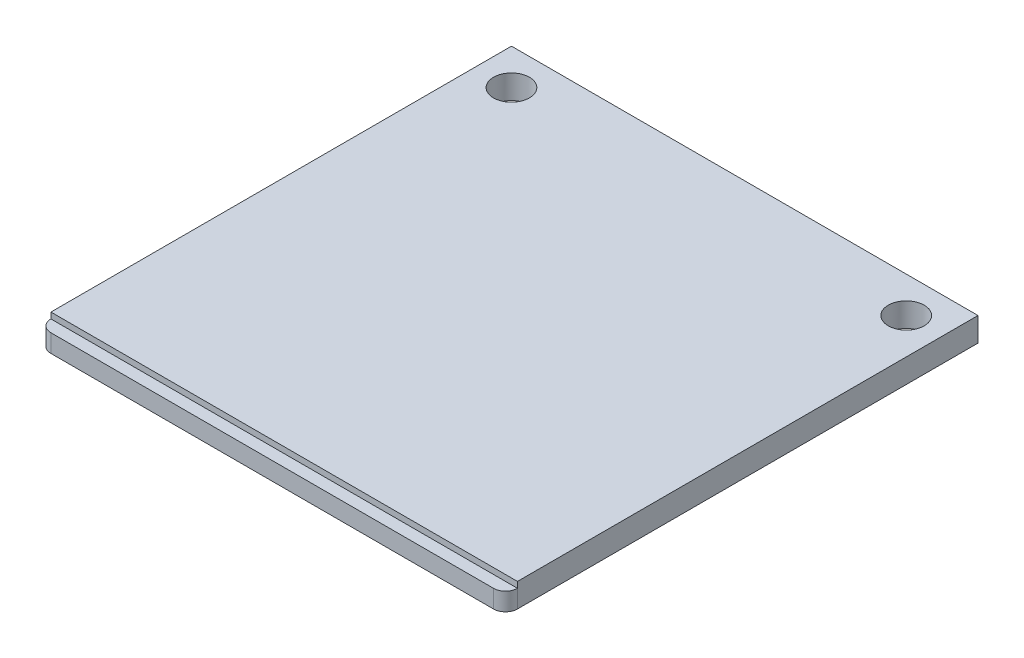
ISO-10303-21;
HEADER;
FILE_DESCRIPTION(('STEP AP214'),'2;1');
FILE_NAME('part.step','',(''),(''),'','','');
FILE_SCHEMA(('AUTOMOTIVE_DESIGN { 1 0 10303 214 1 1 1 1 }'));
ENDSEC;
DATA;
#1=APPLICATION_CONTEXT('core data for automotive mechanical design processes');
#2=APPLICATION_PROTOCOL_DEFINITION('international standard','automotive_design',2000,#1);
#3=PRODUCT_CONTEXT('',#1,'mechanical');
#4=PRODUCT('Part','Part','',(#3));
#5=PRODUCT_RELATED_PRODUCT_CATEGORY('part','',(#4));
#6=PRODUCT_DEFINITION_FORMATION('','',#4);
#7=PRODUCT_DEFINITION_CONTEXT('part definition',#1,'design');
#8=PRODUCT_DEFINITION('design','',#6,#7);
#9=PRODUCT_DEFINITION_SHAPE('','',#8);
#10=(LENGTH_UNIT() NAMED_UNIT(*) SI_UNIT(.MILLI.,.METRE.));
#11=(NAMED_UNIT(*) PLANE_ANGLE_UNIT() SI_UNIT($,.RADIAN.));
#12=(NAMED_UNIT(*) SI_UNIT($,.STERADIAN.) SOLID_ANGLE_UNIT());
#13=UNCERTAINTY_MEASURE_WITH_UNIT(LENGTH_MEASURE(1.E-05),#10,'distance_accuracy_value','');
#14=(GEOMETRIC_REPRESENTATION_CONTEXT(3) GLOBAL_UNCERTAINTY_ASSIGNED_CONTEXT((#13)) GLOBAL_UNIT_ASSIGNED_CONTEXT((#10,
#11,#12)) REPRESENTATION_CONTEXT('',''));
#15=CARTESIAN_POINT('',(0.,0.,0.));
#16=DIRECTION('',(0.,0.,1.));
#17=DIRECTION('',(1.,0.,0.));
#18=AXIS2_PLACEMENT_3D('',#15,#16,#17);
#19=CARTESIAN_POINT('',(0.,2.,0.));
#20=DIRECTION('',(0.,0.,-1.));
#21=DIRECTION('',(-1.,0.,0.));
#22=AXIS2_PLACEMENT_3D('',#19,#20,#21);
#23=PLANE('',#22);
#24=DIRECTION('',(1.,0.,0.));
#25=VECTOR('',#24,1.);
#26=CARTESIAN_POINT('',(0.,1.5,0.));
#27=LINE('',#26,#25);
#28=CARTESIAN_POINT('',(1.,1.5,0.));
#29=VERTEX_POINT('',#28);
#30=CARTESIAN_POINT('',(38.,1.5,0.));
#31=VERTEX_POINT('',#30);
#32=EDGE_CURVE('E106',#29,#31,#27,.T.);
#33=ORIENTED_EDGE('',*,*,#32,.F.);
#34=DIRECTION('',(0.,-1.,0.));
#35=VECTOR('',#34,1.);
#36=CARTESIAN_POINT('',(1.,2.,0.));
#37=LINE('',#36,#35);
#38=CARTESIAN_POINT('',(1.,0.,0.));
#39=VERTEX_POINT('',#38);
#40=EDGE_CURVE('E168',#29,#39,#37,.T.);
#41=ORIENTED_EDGE('',*,*,#40,.T.);
#42=DIRECTION('',(1.,0.,0.));
#43=VECTOR('',#42,1.);
#44=CARTESIAN_POINT('',(0.,0.,0.));
#45=LINE('',#44,#43);
#46=CARTESIAN_POINT('',(38.,0.,0.));
#47=VERTEX_POINT('',#46);
#48=EDGE_CURVE('E161',#39,#47,#45,.T.);
#49=ORIENTED_EDGE('',*,*,#48,.T.);
#50=DIRECTION('',(0.,-1.,0.));
#51=VECTOR('',#50,1.);
#52=CARTESIAN_POINT('',(38.,2.,0.));
#53=LINE('',#52,#51);
#54=EDGE_CURVE('E174',#47,#31,#53,.F.);
#55=ORIENTED_EDGE('',*,*,#54,.T.);
#56=EDGE_LOOP('',(#33,#41,#49,#55));
#57=FACE_BOUND('',#56,.T.);
#58=ADVANCED_FACE('F39',(#57),#23,.F.);
#59=CARTESIAN_POINT('',(39.,2.,0.));
#60=DIRECTION('',(-1.,0.,0.));
#61=DIRECTION('',(0.,0.,1.));
#62=AXIS2_PLACEMENT_3D('',#59,#60,#61);
#63=PLANE('',#62);
#64=DIRECTION('',(0.,1.,0.));
#65=VECTOR('',#64,1.);
#66=CARTESIAN_POINT('',(39.,1.5,-1.));
#67=LINE('',#66,#65);
#68=CARTESIAN_POINT('',(39.,1.5,-1.));
#69=VERTEX_POINT('',#68);
#70=CARTESIAN_POINT('',(39.,2.,-1.));
#71=VERTEX_POINT('',#70);
#72=EDGE_CURVE('E114',#69,#71,#67,.T.);
#73=ORIENTED_EDGE('',*,*,#72,.F.);
#74=DIRECTION('',(0.,-1.,0.));
#75=VECTOR('',#74,1.);
#76=CARTESIAN_POINT('',(39.,2.,-1.));
#77=LINE('',#76,#75);
#78=CARTESIAN_POINT('',(39.,0.,-1.));
#79=VERTEX_POINT('',#78);
#80=EDGE_CURVE('E11',#69,#79,#77,.T.);
#81=ORIENTED_EDGE('',*,*,#80,.T.);
#82=DIRECTION('',(0.,0.,-1.));
#83=VECTOR('',#82,1.);
#84=CARTESIAN_POINT('',(39.,0.,0.));
#85=LINE('',#84,#83);
#86=CARTESIAN_POINT('',(39.,0.,-39.5));
#87=VERTEX_POINT('',#86);
#88=EDGE_CURVE('E183',#79,#87,#85,.T.);
#89=ORIENTED_EDGE('',*,*,#88,.T.);
#90=DIRECTION('',(0.,-1.,0.));
#91=VECTOR('',#90,1.);
#92=CARTESIAN_POINT('',(39.,2.,-39.5));
#93=LINE('',#92,#91);
#94=CARTESIAN_POINT('',(39.,2.,-39.5));
#95=VERTEX_POINT('',#94);
#96=EDGE_CURVE('E172',#95,#87,#93,.T.);
#97=ORIENTED_EDGE('',*,*,#96,.F.);
#98=DIRECTION('',(0.,0.,-1.));
#99=VECTOR('',#98,1.);
#100=CARTESIAN_POINT('',(39.,2.,0.));
#101=LINE('',#100,#99);
#102=EDGE_CURVE('E125',#71,#95,#101,.T.);
#103=ORIENTED_EDGE('',*,*,#102,.F.);
#104=EDGE_LOOP('',(#73,#81,#89,#97,#103));
#105=FACE_BOUND('',#104,.T.);
#106=ADVANCED_FACE('F117',(#105),#63,.F.);
#107=CARTESIAN_POINT('',(0.,2.,0.));
#108=DIRECTION('',(0.,-1.,0.));
#109=DIRECTION('',(0.,0.,-1.));
#110=AXIS2_PLACEMENT_3D('',#107,#108,#109);
#111=PLANE('',#110);
#112=CARTESIAN_POINT('',(36.,2.,-36.5));
#113=DIRECTION('',(0.,1.,0.));
#114=DIRECTION('',(0.,0.,1.));
#115=AXIS2_PLACEMENT_3D('',#112,#113,#114);
#116=CIRCLE('',#115,1.5);
#117=CARTESIAN_POINT('',(36.,2.,-35.));
#118=VERTEX_POINT('',#117);
#119=EDGE_CURVE('E191',#118,#118,#116,.T.);
#120=ORIENTED_EDGE('',*,*,#119,.F.);
#121=EDGE_LOOP('',(#120));
#122=FACE_BOUND('',#121,.T.);
#123=CARTESIAN_POINT('',(3.,2.,-36.5));
#124=DIRECTION('',(0.,1.,0.));
#125=DIRECTION('',(0.,0.,1.));
#126=AXIS2_PLACEMENT_3D('',#123,#124,#125);
#127=CIRCLE('',#126,1.5);
#128=CARTESIAN_POINT('',(3.,2.,-35.));
#129=VERTEX_POINT('',#128);
#130=EDGE_CURVE('E165',#129,#129,#127,.T.);
#131=ORIENTED_EDGE('',*,*,#130,.F.);
#132=EDGE_LOOP('',(#131));
#133=FACE_BOUND('',#132,.T.);
#134=DIRECTION('',(-1.,0.,0.));
#135=VECTOR('',#134,1.);
#136=CARTESIAN_POINT('',(0.,2.,-1.));
#137=LINE('',#136,#135);
#138=CARTESIAN_POINT('',(0.,2.,-1.));
#139=VERTEX_POINT('',#138);
#140=EDGE_CURVE('E171',#71,#139,#137,.T.);
#141=ORIENTED_EDGE('',*,*,#140,.F.);
#142=ORIENTED_EDGE('',*,*,#102,.T.);
#143=DIRECTION('',(-1.,0.,0.));
#144=VECTOR('',#143,1.);
#145=CARTESIAN_POINT('',(0.,2.,-39.5));
#146=LINE('',#145,#144);
#147=CARTESIAN_POINT('',(0.,2.,-39.5));
#148=VERTEX_POINT('',#147);
#149=EDGE_CURVE('E182',#95,#148,#146,.T.);
#150=ORIENTED_EDGE('',*,*,#149,.T.);
#151=DIRECTION('',(0.,0.,1.));
#152=VECTOR('',#151,1.);
#153=CARTESIAN_POINT('',(0.,2.,0.));
#154=LINE('',#153,#152);
#155=EDGE_CURVE('E184',#148,#139,#154,.T.);
#156=ORIENTED_EDGE('',*,*,#155,.T.);
#157=EDGE_LOOP('',(#141,#142,#150,#156));
#158=FACE_BOUND('',#157,.T.);
#159=ADVANCED_FACE('F140',(#122,#133,#158),#111,.F.);
#160=CARTESIAN_POINT('',(0.,2.,0.));
#161=DIRECTION('',(1.,0.,0.));
#162=DIRECTION('',(0.,0.,-1.));
#163=AXIS2_PLACEMENT_3D('',#160,#161,#162);
#164=PLANE('',#163);
#165=DIRECTION('',(0.,0.,1.));
#166=VECTOR('',#165,1.);
#167=CARTESIAN_POINT('',(0.,0.,0.));
#168=LINE('',#167,#166);
#169=CARTESIAN_POINT('',(0.,0.,-39.5));
#170=VERTEX_POINT('',#169);
#171=CARTESIAN_POINT('',(0.,0.,-1.));
#172=VERTEX_POINT('',#171);
#173=EDGE_CURVE('E154',#170,#172,#168,.T.);
#174=ORIENTED_EDGE('',*,*,#173,.T.);
#175=DIRECTION('',(0.,-1.,0.));
#176=VECTOR('',#175,1.);
#177=CARTESIAN_POINT('',(0.,2.,-1.));
#178=LINE('',#177,#176);
#179=CARTESIAN_POINT('',(0.,1.5,-1.));
#180=VERTEX_POINT('',#179);
#181=EDGE_CURVE('E110',#172,#180,#178,.F.);
#182=ORIENTED_EDGE('',*,*,#181,.T.);
#183=DIRECTION('',(0.,1.,0.));
#184=VECTOR('',#183,1.);
#185=CARTESIAN_POINT('',(0.,1.5,-1.));
#186=LINE('',#185,#184);
#187=EDGE_CURVE('E119',#180,#139,#186,.T.);
#188=ORIENTED_EDGE('',*,*,#187,.T.);
#189=ORIENTED_EDGE('',*,*,#155,.F.);
#190=DIRECTION('',(0.,-1.,0.));
#191=VECTOR('',#190,1.);
#192=CARTESIAN_POINT('',(0.,2.,-39.5));
#193=LINE('',#192,#191);
#194=EDGE_CURVE('E157',#148,#170,#193,.T.);
#195=ORIENTED_EDGE('',*,*,#194,.T.);
#196=EDGE_LOOP('',(#174,#182,#188,#189,#195));
#197=FACE_BOUND('',#196,.T.);
#198=ADVANCED_FACE('F142',(#197),#164,.F.);
#199=CARTESIAN_POINT('',(0.,2.,-39.5));
#200=DIRECTION('',(0.,0.,1.));
#201=DIRECTION('',(1.,0.,0.));
#202=AXIS2_PLACEMENT_3D('',#199,#200,#201);
#203=PLANE('',#202);
#204=DIRECTION('',(-1.,0.,0.));
#205=VECTOR('',#204,1.);
#206=CARTESIAN_POINT('',(0.,0.,-39.5));
#207=LINE('',#206,#205);
#208=EDGE_CURVE('E185',#87,#170,#207,.T.);
#209=ORIENTED_EDGE('',*,*,#208,.T.);
#210=ORIENTED_EDGE('',*,*,#194,.F.);
#211=ORIENTED_EDGE('',*,*,#149,.F.);
#212=ORIENTED_EDGE('',*,*,#96,.T.);
#213=EDGE_LOOP('',(#209,#210,#211,#212));
#214=FACE_BOUND('',#213,.T.);
#215=ADVANCED_FACE('F145',(#214),#203,.F.);
#216=CARTESIAN_POINT('',(0.,0.,0.));
#217=DIRECTION('',(0.,-1.,0.));
#218=DIRECTION('',(0.,0.,-1.));
#219=AXIS2_PLACEMENT_3D('',#216,#217,#218);
#220=PLANE('',#219);
#221=CARTESIAN_POINT('',(3.,0.,-36.5));
#222=DIRECTION('',(0.,-1.,0.));
#223=DIRECTION('',(0.,0.,-1.));
#224=AXIS2_PLACEMENT_3D('',#221,#222,#223);
#225=CIRCLE('',#224,1.5);
#226=CARTESIAN_POINT('',(3.,0.,-38.));
#227=VERTEX_POINT('',#226);
#228=EDGE_CURVE('E196',#227,#227,#225,.F.);
#229=ORIENTED_EDGE('',*,*,#228,.T.);
#230=EDGE_LOOP('',(#229));
#231=FACE_BOUND('',#230,.T.);
#232=CARTESIAN_POINT('',(36.,0.,-36.5));
#233=DIRECTION('',(0.,-1.,0.));
#234=DIRECTION('',(0.,0.,-1.));
#235=AXIS2_PLACEMENT_3D('',#232,#233,#234);
#236=CIRCLE('',#235,1.5);
#237=CARTESIAN_POINT('',(36.,0.,-38.));
#238=VERTEX_POINT('',#237);
#239=EDGE_CURVE('E192',#238,#238,#236,.F.);
#240=ORIENTED_EDGE('',*,*,#239,.T.);
#241=EDGE_LOOP('',(#240));
#242=FACE_BOUND('',#241,.T.);
#243=ORIENTED_EDGE('',*,*,#48,.F.);
#244=CARTESIAN_POINT('',(1.,0.,-1.));
#245=DIRECTION('',(0.,-1.,0.));
#246=DIRECTION('',(0.,0.,-1.));
#247=AXIS2_PLACEMENT_3D('',#244,#245,#246);
#248=CIRCLE('',#247,1.);
#249=EDGE_CURVE('E64',#39,#172,#248,.T.);
#250=ORIENTED_EDGE('',*,*,#249,.T.);
#251=ORIENTED_EDGE('',*,*,#173,.F.);
#252=ORIENTED_EDGE('',*,*,#208,.F.);
#253=ORIENTED_EDGE('',*,*,#88,.F.);
#254=CARTESIAN_POINT('',(38.,0.,-1.));
#255=DIRECTION('',(0.,-1.,0.));
#256=DIRECTION('',(0.,0.,-1.));
#257=AXIS2_PLACEMENT_3D('',#254,#255,#256);
#258=CIRCLE('',#257,1.);
#259=EDGE_CURVE('E53',#79,#47,#258,.T.);
#260=ORIENTED_EDGE('',*,*,#259,.T.);
#261=EDGE_LOOP('',(#243,#250,#251,#252,#253,#260));
#262=FACE_BOUND('',#261,.T.);
#263=ADVANCED_FACE('F147',(#231,#242,#262),#220,.T.);
#264=CARTESIAN_POINT('',(36.,-0.00100000000000013,-36.5));
#265=DIRECTION('',(0.,1.,0.));
#266=DIRECTION('',(0.,0.,1.));
#267=AXIS2_PLACEMENT_3D('',#264,#265,#266);
#268=CYLINDRICAL_SURFACE('',#267,1.5);
#269=ORIENTED_EDGE('',*,*,#239,.F.);
#270=EDGE_LOOP('',(#269));
#271=FACE_BOUND('',#270,.T.);
#272=ORIENTED_EDGE('',*,*,#119,.T.);
#273=EDGE_LOOP('',(#272));
#274=FACE_BOUND('',#273,.T.);
#275=ADVANCED_FACE('F206',(#271,#274),#268,.F.);
#276=CARTESIAN_POINT('',(3.,-0.00100000000000013,-36.5));
#277=DIRECTION('',(0.,1.,0.));
#278=DIRECTION('',(0.,0.,1.));
#279=AXIS2_PLACEMENT_3D('',#276,#277,#278);
#280=CYLINDRICAL_SURFACE('',#279,1.5);
#281=ORIENTED_EDGE('',*,*,#228,.F.);
#282=EDGE_LOOP('',(#281));
#283=FACE_BOUND('',#282,.T.);
#284=ORIENTED_EDGE('',*,*,#130,.T.);
#285=EDGE_LOOP('',(#284));
#286=FACE_BOUND('',#285,.T.);
#287=ADVANCED_FACE('F213',(#283,#286),#280,.F.);
#288=CARTESIAN_POINT('',(0.,1.5,-1.));
#289=DIRECTION('',(0.,0.,-1.));
#290=DIRECTION('',(-1.,0.,0.));
#291=AXIS2_PLACEMENT_3D('',#288,#289,#290);
#292=PLANE('',#291);
#293=ORIENTED_EDGE('',*,*,#140,.T.);
#294=ORIENTED_EDGE('',*,*,#187,.F.);
#295=DIRECTION('',(-1.,0.,0.));
#296=VECTOR('',#295,1.);
#297=CARTESIAN_POINT('',(0.,1.5,-1.));
#298=LINE('',#297,#296);
#299=EDGE_CURVE('E103',#69,#180,#298,.T.);
#300=ORIENTED_EDGE('',*,*,#299,.F.);
#301=ORIENTED_EDGE('',*,*,#72,.T.);
#302=EDGE_LOOP('',(#293,#294,#300,#301));
#303=FACE_BOUND('',#302,.T.);
#304=ADVANCED_FACE('F115',(#303),#292,.F.);
#305=CARTESIAN_POINT('',(0.,1.5,0.));
#306=DIRECTION('',(0.,-1.,0.));
#307=DIRECTION('',(0.,0.,-1.));
#308=AXIS2_PLACEMENT_3D('',#305,#306,#307);
#309=PLANE('',#308);
#310=ORIENTED_EDGE('',*,*,#299,.T.);
#311=CARTESIAN_POINT('',(1.,1.5,-1.));
#312=DIRECTION('',(0.,-1.,0.));
#313=DIRECTION('',(0.,0.,-1.));
#314=AXIS2_PLACEMENT_3D('',#311,#312,#313);
#315=CIRCLE('',#314,1.);
#316=EDGE_CURVE('E50',#180,#29,#315,.F.);
#317=ORIENTED_EDGE('',*,*,#316,.T.);
#318=ORIENTED_EDGE('',*,*,#32,.T.);
#319=CARTESIAN_POINT('',(38.,1.5,-1.));
#320=DIRECTION('',(0.,-1.,0.));
#321=DIRECTION('',(0.,0.,-1.));
#322=AXIS2_PLACEMENT_3D('',#319,#320,#321);
#323=CIRCLE('',#322,1.);
#324=EDGE_CURVE('E99',#31,#69,#323,.F.);
#325=ORIENTED_EDGE('',*,*,#324,.T.);
#326=EDGE_LOOP('',(#310,#317,#318,#325));
#327=FACE_BOUND('',#326,.T.);
#328=ADVANCED_FACE('F105',(#327),#309,.F.);
#329=CARTESIAN_POINT('',(1.,2.,-1.));
#330=DIRECTION('',(0.,-1.,0.));
#331=DIRECTION('',(0.,0.,-1.));
#332=AXIS2_PLACEMENT_3D('',#329,#330,#331);
#333=CYLINDRICAL_SURFACE('',#332,1.);
#334=ORIENTED_EDGE('',*,*,#316,.F.);
#335=ORIENTED_EDGE('',*,*,#181,.F.);
#336=ORIENTED_EDGE('',*,*,#249,.F.);
#337=ORIENTED_EDGE('',*,*,#40,.F.);
#338=EDGE_LOOP('',(#334,#335,#336,#337));
#339=FACE_BOUND('',#338,.T.);
#340=ADVANCED_FACE('F127',(#339),#333,.T.);
#341=CARTESIAN_POINT('',(38.,2.,-1.));
#342=DIRECTION('',(0.,-1.,0.));
#343=DIRECTION('',(0.,0.,-1.));
#344=AXIS2_PLACEMENT_3D('',#341,#342,#343);
#345=CYLINDRICAL_SURFACE('',#344,1.);
#346=ORIENTED_EDGE('',*,*,#324,.F.);
#347=ORIENTED_EDGE('',*,*,#54,.F.);
#348=ORIENTED_EDGE('',*,*,#259,.F.);
#349=ORIENTED_EDGE('',*,*,#80,.F.);
#350=EDGE_LOOP('',(#346,#347,#348,#349));
#351=FACE_BOUND('',#350,.T.);
#352=ADVANCED_FACE('F41',(#351),#345,.T.);
#353=CLOSED_SHELL('',(#58,#106,#159,#198,#215,#263,#275,#287,#304,#328,#340,#352));
#354=MANIFOLD_SOLID_BREP('B2',#353);
#355=ADVANCED_BREP_SHAPE_REPRESENTATION('',(#18,#354),#14);
#356=SHAPE_DEFINITION_REPRESENTATION(#9,#355);
ENDSEC;
END-ISO-10303-21;
